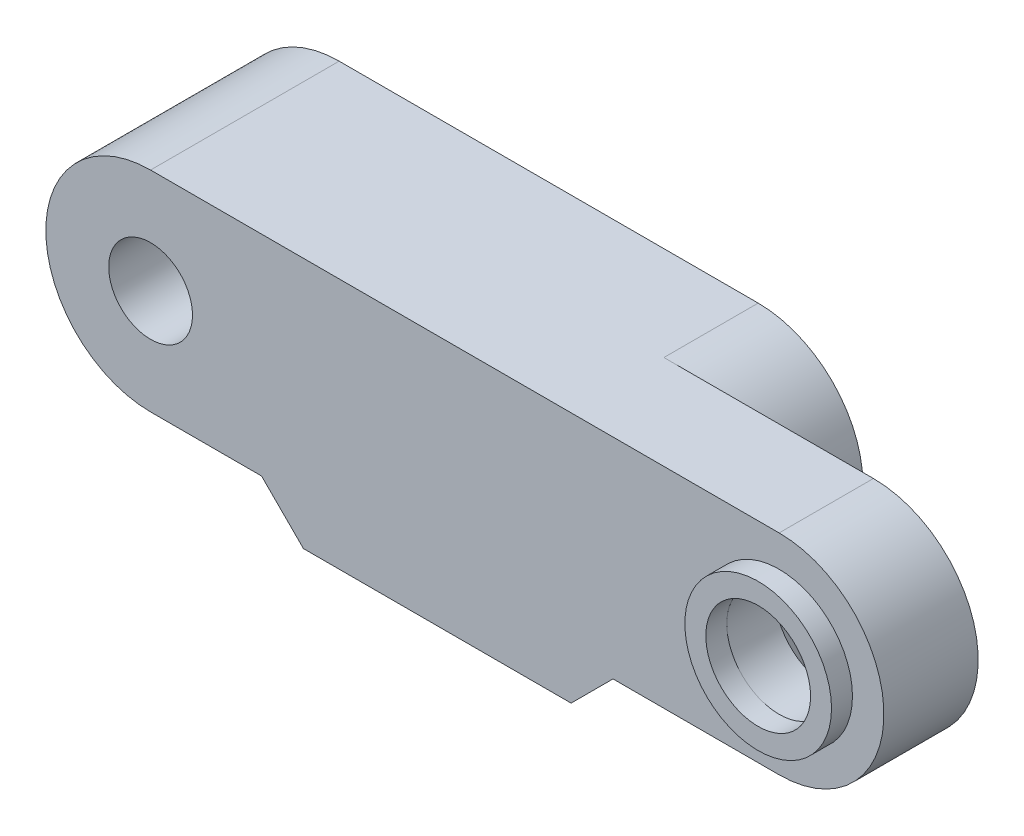
ISO-10303-21;
HEADER;
FILE_DESCRIPTION(('STEP AP214'),'2;1');
FILE_NAME('part.step','',(''),(''),'','','');
FILE_SCHEMA(('AUTOMOTIVE_DESIGN { 1 0 10303 214 1 1 1 1 }'));
ENDSEC;
DATA;
#1=APPLICATION_CONTEXT('core data for automotive mechanical design processes');
#2=APPLICATION_PROTOCOL_DEFINITION('international standard','automotive_design',2000,#1);
#3=PRODUCT_CONTEXT('',#1,'mechanical');
#4=PRODUCT('Part','Part','',(#3));
#5=PRODUCT_RELATED_PRODUCT_CATEGORY('part','',(#4));
#6=PRODUCT_DEFINITION_FORMATION('','',#4);
#7=PRODUCT_DEFINITION_CONTEXT('part definition',#1,'design');
#8=PRODUCT_DEFINITION('design','',#6,#7);
#9=PRODUCT_DEFINITION_SHAPE('','',#8);
#10=(LENGTH_UNIT() NAMED_UNIT(*) SI_UNIT(.MILLI.,.METRE.));
#11=(NAMED_UNIT(*) PLANE_ANGLE_UNIT() SI_UNIT($,.RADIAN.));
#12=(NAMED_UNIT(*) SI_UNIT($,.STERADIAN.) SOLID_ANGLE_UNIT());
#13=UNCERTAINTY_MEASURE_WITH_UNIT(LENGTH_MEASURE(1.E-05),#10,'distance_accuracy_value','');
#14=(GEOMETRIC_REPRESENTATION_CONTEXT(3) GLOBAL_UNCERTAINTY_ASSIGNED_CONTEXT((#13)) GLOBAL_UNIT_ASSIGNED_CONTEXT((#10,
#11,#12)) REPRESENTATION_CONTEXT('',''));
#15=CARTESIAN_POINT('',(0.,0.,0.));
#16=DIRECTION('',(0.,0.,1.));
#17=DIRECTION('',(1.,0.,0.));
#18=AXIS2_PLACEMENT_3D('',#15,#16,#17);
#19=CARTESIAN_POINT('',(0.,-5.,9.));
#20=DIRECTION('',(0.,1.,0.));
#21=DIRECTION('',(0.,0.,1.));
#22=AXIS2_PLACEMENT_3D('',#19,#20,#21);
#23=PLANE('',#22);
#24=DIRECTION('',(0.,0.,-1.));
#25=VECTOR('',#24,1.);
#26=CARTESIAN_POINT('',(5.29562779111053,-5.,40.6227766016838));
#27=LINE('',#26,#25);
#28=CARTESIAN_POINT('',(5.29562779111053,-5.,9.));
#29=VERTEX_POINT('',#28);
#30=CARTESIAN_POINT('',(5.29562779111053,-5.,0.));
#31=VERTEX_POINT('',#30);
#32=EDGE_CURVE('E173',#29,#31,#27,.T.);
#33=ORIENTED_EDGE('',*,*,#32,.F.);
#34=DIRECTION('',(1.,0.,0.));
#35=VECTOR('',#34,1.);
#36=CARTESIAN_POINT('',(0.,-5.,9.));
#37=LINE('',#36,#35);
#38=CARTESIAN_POINT('',(0.,-5.,9.));
#39=VERTEX_POINT('',#38);
#40=EDGE_CURVE('E161',#39,#29,#37,.T.);
#41=ORIENTED_EDGE('',*,*,#40,.F.);
#42=DIRECTION('',(0.,0.,-1.));
#43=VECTOR('',#42,1.);
#44=CARTESIAN_POINT('',(0.,-5.,9.));
#45=LINE('',#44,#43);
#46=CARTESIAN_POINT('',(0.,-5.,0.));
#47=VERTEX_POINT('',#46);
#48=EDGE_CURVE('E82',#39,#47,#45,.T.);
#49=ORIENTED_EDGE('',*,*,#48,.T.);
#50=DIRECTION('',(1.,0.,0.));
#51=VECTOR('',#50,1.);
#52=CARTESIAN_POINT('',(0.,-5.,0.));
#53=LINE('',#52,#51);
#54=EDGE_CURVE('E89',#47,#31,#53,.T.);
#55=ORIENTED_EDGE('',*,*,#54,.T.);
#56=EDGE_LOOP('',(#33,#41,#49,#55));
#57=FACE_BOUND('',#56,.T.);
#58=ADVANCED_FACE('F74',(#57),#23,.F.);
#59=CARTESIAN_POINT('',(30.,0.,9.));
#60=DIRECTION('',(0.,0.,-1.));
#61=DIRECTION('',(-1.,0.,0.));
#62=AXIS2_PLACEMENT_3D('',#59,#60,#61);
#63=CYLINDRICAL_SURFACE('',#62,5.);
#64=CARTESIAN_POINT('',(30.,0.,4.5));
#65=DIRECTION('',(0.,0.,-1.));
#66=DIRECTION('',(-1.,0.,0.));
#67=AXIS2_PLACEMENT_3D('',#64,#65,#66);
#68=CIRCLE('',#67,5.);
#69=CARTESIAN_POINT('',(30.,5.,4.5));
#70=VERTEX_POINT('',#69);
#71=CARTESIAN_POINT('',(30.,-5.,4.5));
#72=VERTEX_POINT('',#71);
#73=EDGE_CURVE('E224',#70,#72,#68,.T.);
#74=ORIENTED_EDGE('',*,*,#73,.F.);
#75=DIRECTION('',(0.,0.,-1.));
#76=VECTOR('',#75,1.);
#77=CARTESIAN_POINT('',(30.,5.,9.));
#78=LINE('',#77,#76);
#79=CARTESIAN_POINT('',(30.,5.,9.));
#80=VERTEX_POINT('',#79);
#81=EDGE_CURVE('E249',#80,#70,#78,.T.);
#82=ORIENTED_EDGE('',*,*,#81,.F.);
#83=CARTESIAN_POINT('',(30.,0.,9.));
#84=DIRECTION('',(0.,0.,1.));
#85=DIRECTION('',(1.,0.,0.));
#86=AXIS2_PLACEMENT_3D('',#83,#84,#85);
#87=CIRCLE('',#86,5.);
#88=CARTESIAN_POINT('',(30.,-5.,9.));
#89=VERTEX_POINT('',#88);
#90=EDGE_CURVE('E237',#89,#80,#87,.T.);
#91=ORIENTED_EDGE('',*,*,#90,.F.);
#92=DIRECTION('',(0.,0.,-1.));
#93=VECTOR('',#92,1.);
#94=CARTESIAN_POINT('',(30.,-5.,9.));
#95=LINE('',#94,#93);
#96=EDGE_CURVE('E252',#89,#72,#95,.T.);
#97=ORIENTED_EDGE('',*,*,#96,.T.);
#98=EDGE_LOOP('',(#74,#82,#91,#97));
#99=FACE_BOUND('',#98,.T.);
#100=ADVANCED_FACE('F276',(#99),#63,.T.);
#101=CARTESIAN_POINT('',(0.,5.,9.));
#102=DIRECTION('',(0.,-1.,0.));
#103=DIRECTION('',(0.,0.,-1.));
#104=AXIS2_PLACEMENT_3D('',#101,#102,#103);
#105=PLANE('',#104);
#106=DIRECTION('',(0.,0.,-1.));
#107=VECTOR('',#106,1.);
#108=CARTESIAN_POINT('',(0.,5.,9.));
#109=LINE('',#108,#107);
#110=CARTESIAN_POINT('',(0.,5.,9.));
#111=VERTEX_POINT('',#110);
#112=CARTESIAN_POINT('',(0.,5.,0.));
#113=VERTEX_POINT('',#112);
#114=EDGE_CURVE('E241',#111,#113,#109,.T.);
#115=ORIENTED_EDGE('',*,*,#114,.F.);
#116=DIRECTION('',(-1.,0.,0.));
#117=VECTOR('',#116,1.);
#118=CARTESIAN_POINT('',(0.,5.,9.));
#119=LINE('',#118,#117);
#120=EDGE_CURVE('E239',#80,#111,#119,.T.);
#121=ORIENTED_EDGE('',*,*,#120,.F.);
#122=ORIENTED_EDGE('',*,*,#81,.T.);
#123=DIRECTION('',(1.,0.,0.));
#124=VECTOR('',#123,1.);
#125=CARTESIAN_POINT('',(0.,5.,4.5));
#126=LINE('',#125,#124);
#127=CARTESIAN_POINT('',(20.,5.,4.5));
#128=VERTEX_POINT('',#127);
#129=EDGE_CURVE('E222',#128,#70,#126,.T.);
#130=ORIENTED_EDGE('',*,*,#129,.F.);
#131=DIRECTION('',(0.,0.,-1.));
#132=VECTOR('',#131,1.);
#133=CARTESIAN_POINT('',(20.,5.,4.5));
#134=LINE('',#133,#132);
#135=CARTESIAN_POINT('',(20.,5.,0.));
#136=VERTEX_POINT('',#135);
#137=EDGE_CURVE('E217',#128,#136,#134,.T.);
#138=ORIENTED_EDGE('',*,*,#137,.T.);
#139=DIRECTION('',(-1.,0.,0.));
#140=VECTOR('',#139,1.);
#141=CARTESIAN_POINT('',(0.,5.,0.));
#142=LINE('',#141,#140);
#143=EDGE_CURVE('E235',#136,#113,#142,.T.);
#144=ORIENTED_EDGE('',*,*,#143,.T.);
#145=EDGE_LOOP('',(#115,#121,#122,#130,#138,#144));
#146=FACE_BOUND('',#145,.T.);
#147=ADVANCED_FACE('F280',(#146),#105,.F.);
#148=CARTESIAN_POINT('',(0.,0.,0.));
#149=DIRECTION('',(0.,0.,1.));
#150=DIRECTION('',(1.,0.,0.));
#151=AXIS2_PLACEMENT_3D('',#148,#149,#150);
#152=PLANE('',#151);
#153=DIRECTION('',(0.707106781186546,-0.707106781186549,0.));
#154=VECTOR('',#153,1.);
#155=CARTESIAN_POINT('',(0.14781389555527,0.14781389555527,0.));
#156=LINE('',#155,#154);
#157=CARTESIAN_POINT('',(7.29562779111052,-7.,0.));
#158=VERTEX_POINT('',#157);
#159=EDGE_CURVE('E169',#31,#158,#156,.T.);
#160=ORIENTED_EDGE('',*,*,#159,.F.);
#161=ORIENTED_EDGE('',*,*,#54,.F.);
#162=CARTESIAN_POINT('',(0.,0.,0.));
#163=DIRECTION('',(0.,0.,1.));
#164=DIRECTION('',(1.,0.,0.));
#165=AXIS2_PLACEMENT_3D('',#162,#163,#164);
#166=CIRCLE('',#165,5.);
#167=EDGE_CURVE('E242',#113,#47,#166,.T.);
#168=ORIENTED_EDGE('',*,*,#167,.F.);
#169=ORIENTED_EDGE('',*,*,#143,.F.);
#170=CARTESIAN_POINT('',(20.,0.,0.));
#171=DIRECTION('',(0.,0.,-1.));
#172=DIRECTION('',(-1.,0.,0.));
#173=AXIS2_PLACEMENT_3D('',#170,#171,#172);
#174=CIRCLE('',#173,5.);
#175=CARTESIAN_POINT('',(23.5355339059328,-3.53553390593273,0.));
#176=VERTEX_POINT('',#175);
#177=EDGE_CURVE('E214',#136,#176,#174,.T.);
#178=ORIENTED_EDGE('',*,*,#177,.T.);
#179=DIRECTION('',(-0.707106781186546,-0.707106781186549,0.));
#180=VECTOR('',#179,1.);
#181=CARTESIAN_POINT('',(13.5355339059328,-13.5355339059327,0.));
#182=LINE('',#181,#180);
#183=CARTESIAN_POINT('',(20.0710678118655,-7.,0.));
#184=VERTEX_POINT('',#183);
#185=EDGE_CURVE('E163',#176,#184,#182,.T.);
#186=ORIENTED_EDGE('',*,*,#185,.T.);
#187=DIRECTION('',(-1.,0.,0.));
#188=VECTOR('',#187,1.);
#189=CARTESIAN_POINT('',(0.,-7.,0.));
#190=LINE('',#189,#188);
#191=EDGE_CURVE('E183',#184,#158,#190,.T.);
#192=ORIENTED_EDGE('',*,*,#191,.T.);
#193=EDGE_LOOP('',(#160,#161,#168,#169,#178,#186,#192));
#194=FACE_BOUND('',#193,.T.);
#195=CARTESIAN_POINT('',(0.,0.,0.));
#196=DIRECTION('',(0.,0.,1.));
#197=DIRECTION('',(1.,0.,0.));
#198=AXIS2_PLACEMENT_3D('',#195,#196,#197);
#199=CIRCLE('',#198,2.);
#200=CARTESIAN_POINT('',(2.,0.,0.));
#201=VERTEX_POINT('',#200);
#202=EDGE_CURVE('E232',#201,#201,#199,.T.);
#203=ORIENTED_EDGE('',*,*,#202,.T.);
#204=EDGE_LOOP('',(#203));
#205=FACE_BOUND('',#204,.T.);
#206=ADVANCED_FACE('F258',(#194,#205),#152,.F.);
#207=CARTESIAN_POINT('',(30.,0.,-1.));
#208=DIRECTION('',(0.,0.,1.));
#209=DIRECTION('',(1.,0.,0.));
#210=AXIS2_PLACEMENT_3D('',#207,#208,#209);
#211=CYLINDRICAL_SURFACE('',#210,2.55);
#212=CARTESIAN_POINT('',(30.,0.,6.65));
#213=DIRECTION('',(0.,0.,-1.));
#214=DIRECTION('',(-1.,0.,0.));
#215=AXIS2_PLACEMENT_3D('',#212,#213,#214);
#216=CIRCLE('',#215,2.55);
#217=CARTESIAN_POINT('',(27.45,0.,6.65));
#218=VERTEX_POINT('',#217);
#219=EDGE_CURVE('E211',#218,#218,#216,.T.);
#220=ORIENTED_EDGE('',*,*,#219,.T.);
#221=EDGE_LOOP('',(#220));
#222=FACE_BOUND('',#221,.T.);
#223=CARTESIAN_POINT('',(30.,0.,9.));
#224=DIRECTION('',(0.,0.,1.));
#225=DIRECTION('',(1.,0.,0.));
#226=AXIS2_PLACEMENT_3D('',#223,#224,#225);
#227=CIRCLE('',#226,2.55);
#228=CARTESIAN_POINT('',(32.55,0.,9.));
#229=VERTEX_POINT('',#228);
#230=EDGE_CURVE('E203',#229,#229,#227,.F.);
#231=ORIENTED_EDGE('',*,*,#230,.F.);
#232=EDGE_LOOP('',(#231));
#233=FACE_BOUND('',#232,.T.);
#234=ADVANCED_FACE('F287',(#222,#233),#211,.F.);
#235=CARTESIAN_POINT('',(0.,0.,9.));
#236=DIRECTION('',(0.,0.,-1.));
#237=DIRECTION('',(-1.,0.,0.));
#238=AXIS2_PLACEMENT_3D('',#235,#236,#237);
#239=CYLINDRICAL_SURFACE('',#238,5.);
#240=ORIENTED_EDGE('',*,*,#167,.T.);
#241=ORIENTED_EDGE('',*,*,#48,.F.);
#242=CARTESIAN_POINT('',(0.,0.,9.));
#243=DIRECTION('',(0.,0.,1.));
#244=DIRECTION('',(1.,0.,0.));
#245=AXIS2_PLACEMENT_3D('',#242,#243,#244);
#246=CIRCLE('',#245,5.);
#247=EDGE_CURVE('E233',#111,#39,#246,.T.);
#248=ORIENTED_EDGE('',*,*,#247,.F.);
#249=ORIENTED_EDGE('',*,*,#114,.T.);
#250=EDGE_LOOP('',(#240,#241,#248,#249));
#251=FACE_BOUND('',#250,.T.);
#252=ADVANCED_FACE('F76',(#251),#239,.T.);
#253=CARTESIAN_POINT('',(22.0710678118655,-5.,9.));
#254=VERTEX_POINT('',#253);
#255=EDGE_CURVE('E97',#254,#89,#37,.T.);
#256=ORIENTED_EDGE('',*,*,#255,.F.);
#257=DIRECTION('',(0.,0.,-1.));
#258=VECTOR('',#257,1.);
#259=CARTESIAN_POINT('',(22.0710678118655,-5.,9.));
#260=LINE('',#259,#258);
#261=CARTESIAN_POINT('',(22.0710678118655,-5.,4.5));
#262=VERTEX_POINT('',#261);
#263=EDGE_CURVE('E191',#254,#262,#260,.T.);
#264=ORIENTED_EDGE('',*,*,#263,.T.);
#265=DIRECTION('',(-1.,0.,0.));
#266=VECTOR('',#265,1.);
#267=CARTESIAN_POINT('',(0.,-5.,4.5));
#268=LINE('',#267,#266);
#269=EDGE_CURVE('E226',#72,#262,#268,.T.);
#270=ORIENTED_EDGE('',*,*,#269,.F.);
#271=ORIENTED_EDGE('',*,*,#96,.F.);
#272=EDGE_LOOP('',(#256,#264,#270,#271));
#273=FACE_BOUND('',#272,.T.);
#274=ADVANCED_FACE('F272',(#273),#23,.F.);
#275=CARTESIAN_POINT('',(0.,0.,9.));
#276=DIRECTION('',(0.,0.,1.));
#277=DIRECTION('',(1.,0.,0.));
#278=AXIS2_PLACEMENT_3D('',#275,#276,#277);
#279=PLANE('',#278);
#280=DIRECTION('',(-0.707106781186546,-0.707106781186549,0.));
#281=VECTOR('',#280,1.);
#282=CARTESIAN_POINT('',(13.5355339059328,-13.5355339059327,9.));
#283=LINE('',#282,#281);
#284=CARTESIAN_POINT('',(20.0710678118655,-7.,9.));
#285=VERTEX_POINT('',#284);
#286=EDGE_CURVE('E178',#254,#285,#283,.T.);
#287=ORIENTED_EDGE('',*,*,#286,.F.);
#288=ORIENTED_EDGE('',*,*,#255,.T.);
#289=ORIENTED_EDGE('',*,*,#90,.T.);
#290=ORIENTED_EDGE('',*,*,#120,.T.);
#291=ORIENTED_EDGE('',*,*,#247,.T.);
#292=ORIENTED_EDGE('',*,*,#40,.T.);
#293=DIRECTION('',(0.707106781186546,-0.707106781186549,0.));
#294=VECTOR('',#293,1.);
#295=CARTESIAN_POINT('',(0.14781389555527,0.14781389555527,9.));
#296=LINE('',#295,#294);
#297=CARTESIAN_POINT('',(7.29562779111052,-7.,9.));
#298=VERTEX_POINT('',#297);
#299=EDGE_CURVE('E152',#29,#298,#296,.T.);
#300=ORIENTED_EDGE('',*,*,#299,.T.);
#301=DIRECTION('',(-1.,0.,0.));
#302=VECTOR('',#301,1.);
#303=CARTESIAN_POINT('',(0.,-7.,9.));
#304=LINE('',#303,#302);
#305=EDGE_CURVE('E158',#285,#298,#304,.T.);
#306=ORIENTED_EDGE('',*,*,#305,.F.);
#307=EDGE_LOOP('',(#287,#288,#289,#290,#291,#292,#300,#306));
#308=FACE_BOUND('',#307,.T.);
#309=CARTESIAN_POINT('',(30.,0.,9.));
#310=DIRECTION('',(0.,0.,1.));
#311=DIRECTION('',(1.,0.,0.));
#312=AXIS2_PLACEMENT_3D('',#309,#310,#311);
#313=CIRCLE('',#312,3.5);
#314=CARTESIAN_POINT('',(33.5,0.,9.));
#315=VERTEX_POINT('',#314);
#316=EDGE_CURVE('E197',#315,#315,#313,.T.);
#317=ORIENTED_EDGE('',*,*,#316,.F.);
#318=EDGE_LOOP('',(#317));
#319=FACE_BOUND('',#318,.T.);
#320=CARTESIAN_POINT('',(0.,0.,9.));
#321=DIRECTION('',(0.,0.,1.));
#322=DIRECTION('',(1.,0.,0.));
#323=AXIS2_PLACEMENT_3D('',#320,#321,#322);
#324=CIRCLE('',#323,2.);
#325=CARTESIAN_POINT('',(2.,0.,9.));
#326=VERTEX_POINT('',#325);
#327=EDGE_CURVE('E229',#326,#326,#324,.T.);
#328=ORIENTED_EDGE('',*,*,#327,.F.);
#329=EDGE_LOOP('',(#328));
#330=FACE_BOUND('',#329,.T.);
#331=ADVANCED_FACE('F155',(#308,#319,#330),#279,.T.);
#332=CARTESIAN_POINT('',(0.,0.,-1.));
#333=DIRECTION('',(0.,0.,1.));
#334=DIRECTION('',(1.,0.,0.));
#335=AXIS2_PLACEMENT_3D('',#332,#333,#334);
#336=CYLINDRICAL_SURFACE('',#335,2.);
#337=ORIENTED_EDGE('',*,*,#327,.T.);
#338=EDGE_LOOP('',(#337));
#339=FACE_BOUND('',#338,.T.);
#340=ORIENTED_EDGE('',*,*,#202,.F.);
#341=EDGE_LOOP('',(#340));
#342=FACE_BOUND('',#341,.T.);
#343=ADVANCED_FACE('F260',(#339,#342),#336,.F.);
#344=CARTESIAN_POINT('',(15.,0.,4.5));
#345=DIRECTION('',(0.,0.,-1.));
#346=DIRECTION('',(-1.,0.,0.));
#347=AXIS2_PLACEMENT_3D('',#344,#345,#346);
#348=PLANE('',#347);
#349=DIRECTION('',(-0.707106781186546,-0.707106781186549,0.));
#350=VECTOR('',#349,1.);
#351=CARTESIAN_POINT('',(21.0355339059328,-6.03553390593274,4.5));
#352=LINE('',#351,#350);
#353=CARTESIAN_POINT('',(23.5355339059328,-3.53553390593274,4.5));
#354=VERTEX_POINT('',#353);
#355=EDGE_CURVE('E188',#354,#262,#352,.T.);
#356=ORIENTED_EDGE('',*,*,#355,.F.);
#357=CARTESIAN_POINT('',(20.,0.,4.5));
#358=DIRECTION('',(0.,0.,-1.));
#359=DIRECTION('',(-1.,0.,0.));
#360=AXIS2_PLACEMENT_3D('',#357,#358,#359);
#361=CIRCLE('',#360,5.);
#362=EDGE_CURVE('E215',#128,#354,#361,.T.);
#363=ORIENTED_EDGE('',*,*,#362,.F.);
#364=ORIENTED_EDGE('',*,*,#129,.T.);
#365=ORIENTED_EDGE('',*,*,#73,.T.);
#366=ORIENTED_EDGE('',*,*,#269,.T.);
#367=EDGE_LOOP('',(#356,#363,#364,#365,#366));
#368=FACE_BOUND('',#367,.T.);
#369=CARTESIAN_POINT('',(30.,0.,4.5));
#370=DIRECTION('',(0.,0.,-1.));
#371=DIRECTION('',(-1.,0.,0.));
#372=AXIS2_PLACEMENT_3D('',#369,#370,#371);
#373=CIRCLE('',#372,4.7);
#374=CARTESIAN_POINT('',(25.3,0.,4.5));
#375=VERTEX_POINT('',#374);
#376=EDGE_CURVE('E208',#375,#375,#373,.T.);
#377=ORIENTED_EDGE('',*,*,#376,.F.);
#378=EDGE_LOOP('',(#377));
#379=FACE_BOUND('',#378,.T.);
#380=ADVANCED_FACE('F262',(#368,#379),#348,.T.);
#381=CARTESIAN_POINT('',(20.,0.,4.5));
#382=DIRECTION('',(0.,0.,-1.));
#383=DIRECTION('',(-1.,0.,0.));
#384=AXIS2_PLACEMENT_3D('',#381,#382,#383);
#385=CYLINDRICAL_SURFACE('',#384,5.);
#386=DIRECTION('',(0.,0.,-1.));
#387=VECTOR('',#386,1.);
#388=CARTESIAN_POINT('',(23.5355339059328,-3.53553390593274,4.5));
#389=LINE('',#388,#387);
#390=EDGE_CURVE('E13',#176,#354,#389,.F.);
#391=ORIENTED_EDGE('',*,*,#390,.F.);
#392=ORIENTED_EDGE('',*,*,#177,.F.);
#393=ORIENTED_EDGE('',*,*,#137,.F.);
#394=ORIENTED_EDGE('',*,*,#362,.T.);
#395=EDGE_LOOP('',(#391,#392,#393,#394));
#396=FACE_BOUND('',#395,.T.);
#397=ADVANCED_FACE('F269',(#396),#385,.T.);
#398=CARTESIAN_POINT('',(30.,0.,4.5));
#399=DIRECTION('',(0.,0.,-1.));
#400=DIRECTION('',(-1.,0.,0.));
#401=AXIS2_PLACEMENT_3D('',#398,#399,#400);
#402=CONICAL_SURFACE('',#401,4.7,0.785398163397449);
#403=ORIENTED_EDGE('',*,*,#376,.T.);
#404=EDGE_LOOP('',(#403));
#405=FACE_BOUND('',#404,.T.);
#406=ORIENTED_EDGE('',*,*,#219,.F.);
#407=EDGE_LOOP('',(#406));
#408=FACE_BOUND('',#407,.T.);
#409=ADVANCED_FACE('F315',(#405,#408),#402,.F.);
#410=CARTESIAN_POINT('',(30.,0.,9.));
#411=DIRECTION('',(0.,0.,1.));
#412=DIRECTION('',(1.,0.,0.));
#413=AXIS2_PLACEMENT_3D('',#410,#411,#412);
#414=PLANE('',#413);
#415=CARTESIAN_POINT('',(30.,0.,9.));
#416=DIRECTION('',(0.,0.,1.));
#417=DIRECTION('',(1.,0.,0.));
#418=AXIS2_PLACEMENT_3D('',#415,#416,#417);
#419=CIRCLE('',#418,2.5);
#420=CARTESIAN_POINT('',(32.5,0.,9.));
#421=VERTEX_POINT('',#420);
#422=EDGE_CURVE('E193',#421,#421,#419,.T.);
#423=ORIENTED_EDGE('',*,*,#422,.T.);
#424=EDGE_LOOP('',(#423));
#425=FACE_BOUND('',#424,.T.);
#426=ORIENTED_EDGE('',*,*,#230,.T.);
#427=EDGE_LOOP('',(#426));
#428=FACE_BOUND('',#427,.T.);
#429=ADVANCED_FACE('F318',(#425,#428),#414,.F.);
#430=CARTESIAN_POINT('',(30.,0.,10.));
#431=DIRECTION('',(0.,0.,1.));
#432=DIRECTION('',(1.,0.,0.));
#433=AXIS2_PLACEMENT_3D('',#430,#431,#432);
#434=PLANE('',#433);
#435=CARTESIAN_POINT('',(30.,0.,10.));
#436=DIRECTION('',(0.,0.,1.));
#437=DIRECTION('',(1.,0.,0.));
#438=AXIS2_PLACEMENT_3D('',#435,#436,#437);
#439=CIRCLE('',#438,3.5);
#440=CARTESIAN_POINT('',(33.5,0.,10.));
#441=VERTEX_POINT('',#440);
#442=EDGE_CURVE('E200',#441,#441,#439,.T.);
#443=ORIENTED_EDGE('',*,*,#442,.T.);
#444=EDGE_LOOP('',(#443));
#445=FACE_BOUND('',#444,.T.);
#446=CARTESIAN_POINT('',(30.,0.,10.));
#447=DIRECTION('',(0.,0.,1.));
#448=DIRECTION('',(1.,0.,0.));
#449=AXIS2_PLACEMENT_3D('',#446,#447,#448);
#450=CIRCLE('',#449,2.5);
#451=CARTESIAN_POINT('',(32.5,0.,10.));
#452=VERTEX_POINT('',#451);
#453=EDGE_CURVE('E194',#452,#452,#450,.T.);
#454=ORIENTED_EDGE('',*,*,#453,.F.);
#455=EDGE_LOOP('',(#454));
#456=FACE_BOUND('',#455,.T.);
#457=ADVANCED_FACE('F325',(#445,#456),#434,.T.);
#458=CARTESIAN_POINT('',(30.,0.,10.));
#459=DIRECTION('',(0.,0.,-1.));
#460=DIRECTION('',(-1.,0.,0.));
#461=AXIS2_PLACEMENT_3D('',#458,#459,#460);
#462=CYLINDRICAL_SURFACE('',#461,3.5);
#463=ORIENTED_EDGE('',*,*,#442,.F.);
#464=EDGE_LOOP('',(#463));
#465=FACE_BOUND('',#464,.T.);
#466=ORIENTED_EDGE('',*,*,#316,.T.);
#467=EDGE_LOOP('',(#466));
#468=FACE_BOUND('',#467,.T.);
#469=ADVANCED_FACE('F331',(#465,#468),#462,.T.);
#470=CARTESIAN_POINT('',(30.,0.,10.));
#471=DIRECTION('',(0.,0.,-1.));
#472=DIRECTION('',(-1.,0.,0.));
#473=AXIS2_PLACEMENT_3D('',#470,#471,#472);
#474=CYLINDRICAL_SURFACE('',#473,2.5);
#475=ORIENTED_EDGE('',*,*,#453,.T.);
#476=EDGE_LOOP('',(#475));
#477=FACE_BOUND('',#476,.T.);
#478=ORIENTED_EDGE('',*,*,#422,.F.);
#479=EDGE_LOOP('',(#478));
#480=FACE_BOUND('',#479,.T.);
#481=ADVANCED_FACE('F337',(#477,#480),#474,.F.);
#482=CARTESIAN_POINT('',(13.5355339059328,-13.5355339059327,40.6227766016838));
#483=DIRECTION('',(0.707106781186549,-0.707106781186546,0.));
#484=DIRECTION('',(0.707106781186546,0.707106781186549,0.));
#485=AXIS2_PLACEMENT_3D('',#482,#483,#484);
#486=PLANE('',#485);
#487=ORIENTED_EDGE('',*,*,#263,.F.);
#488=ORIENTED_EDGE('',*,*,#286,.T.);
#489=DIRECTION('',(0.,0.,-1.));
#490=VECTOR('',#489,1.);
#491=CARTESIAN_POINT('',(20.0710678118655,-7.,40.6227766016838));
#492=LINE('',#491,#490);
#493=EDGE_CURVE('E176',#285,#184,#492,.T.);
#494=ORIENTED_EDGE('',*,*,#493,.T.);
#495=ORIENTED_EDGE('',*,*,#185,.F.);
#496=ORIENTED_EDGE('',*,*,#390,.T.);
#497=ORIENTED_EDGE('',*,*,#355,.T.);
#498=EDGE_LOOP('',(#487,#488,#494,#495,#496,#497));
#499=FACE_BOUND('',#498,.T.);
#500=ADVANCED_FACE('F301',(#499),#486,.T.);
#501=CARTESIAN_POINT('',(0.,-7.,40.6227766016838));
#502=DIRECTION('',(0.,-1.,0.));
#503=DIRECTION('',(1.,0.,0.));
#504=AXIS2_PLACEMENT_3D('',#501,#502,#503);
#505=PLANE('',#504);
#506=ORIENTED_EDGE('',*,*,#493,.F.);
#507=ORIENTED_EDGE('',*,*,#305,.T.);
#508=DIRECTION('',(0.,0.,-1.));
#509=VECTOR('',#508,1.);
#510=CARTESIAN_POINT('',(7.29562779111052,-7.,40.6227766016838));
#511=LINE('',#510,#509);
#512=EDGE_CURVE('E166',#298,#158,#511,.T.);
#513=ORIENTED_EDGE('',*,*,#512,.T.);
#514=ORIENTED_EDGE('',*,*,#191,.F.);
#515=EDGE_LOOP('',(#506,#507,#513,#514));
#516=FACE_BOUND('',#515,.T.);
#517=ADVANCED_FACE('F175',(#516),#505,.T.);
#518=CARTESIAN_POINT('',(0.14781389555527,0.14781389555527,40.6227766016838));
#519=DIRECTION('',(0.707106781186549,0.707106781186546,0.));
#520=DIRECTION('',(-0.707106781186546,0.707106781186549,0.));
#521=AXIS2_PLACEMENT_3D('',#518,#519,#520);
#522=PLANE('',#521);
#523=ORIENTED_EDGE('',*,*,#299,.F.);
#524=ORIENTED_EDGE('',*,*,#32,.T.);
#525=ORIENTED_EDGE('',*,*,#159,.T.);
#526=ORIENTED_EDGE('',*,*,#512,.F.);
#527=EDGE_LOOP('',(#523,#524,#525,#526));
#528=FACE_BOUND('',#527,.T.);
#529=ADVANCED_FACE('F167',(#528),#522,.F.);
#530=CLOSED_SHELL('',(#58,#100,#147,#206,#234,#252,#274,#331,#343,#380,#397,#409,#429,#457,#469,
#481,#500,#517,#529));
#531=MANIFOLD_SOLID_BREP('B2',#530);
#532=ADVANCED_BREP_SHAPE_REPRESENTATION('',(#18,#531),#14);
#533=SHAPE_DEFINITION_REPRESENTATION(#9,#532);
ENDSEC;
END-ISO-10303-21;
